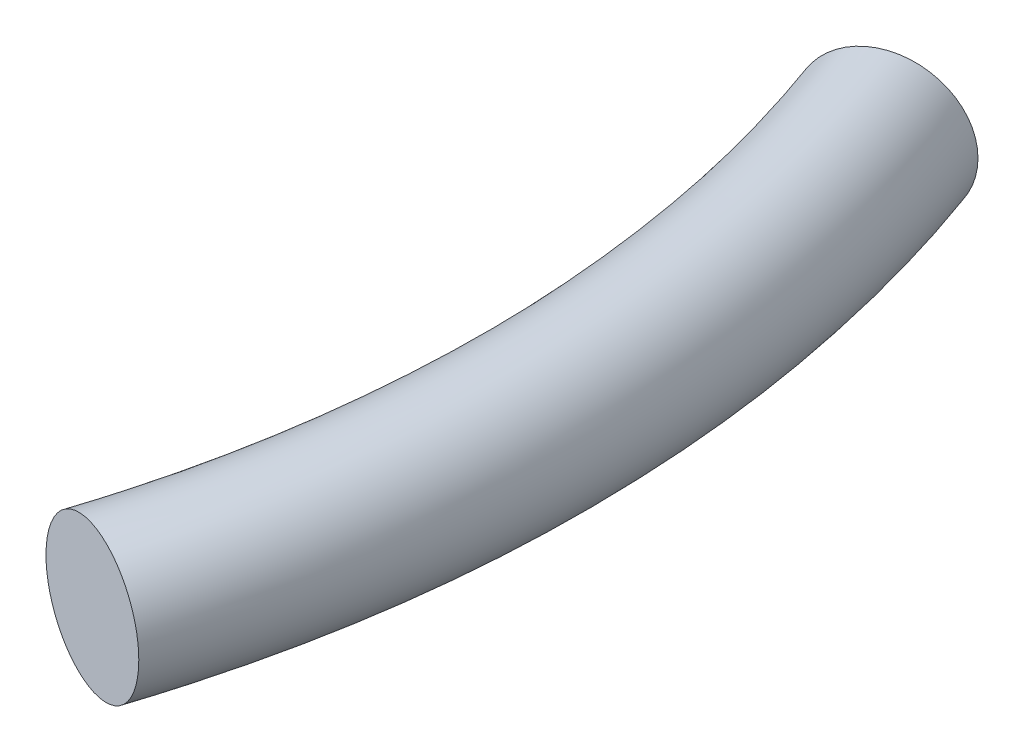
ISO-10303-21;
HEADER;
FILE_DESCRIPTION(('STEP AP214'),'2;1');
FILE_NAME('part.step','',(''),(''),'','','');
FILE_SCHEMA(('AUTOMOTIVE_DESIGN { 1 0 10303 214 1 1 1 1 }'));
ENDSEC;
DATA;
#1=APPLICATION_CONTEXT('core data for automotive mechanical design processes');
#2=APPLICATION_PROTOCOL_DEFINITION('international standard','automotive_design',2000,#1);
#3=PRODUCT_CONTEXT('',#1,'mechanical');
#4=PRODUCT('Part','Part','',(#3));
#5=PRODUCT_RELATED_PRODUCT_CATEGORY('part','',(#4));
#6=PRODUCT_DEFINITION_FORMATION('','',#4);
#7=PRODUCT_DEFINITION_CONTEXT('part definition',#1,'design');
#8=PRODUCT_DEFINITION('design','',#6,#7);
#9=PRODUCT_DEFINITION_SHAPE('','',#8);
#10=(LENGTH_UNIT() NAMED_UNIT(*) SI_UNIT(.MILLI.,.METRE.));
#11=(NAMED_UNIT(*) PLANE_ANGLE_UNIT() SI_UNIT($,.RADIAN.));
#12=(NAMED_UNIT(*) SI_UNIT($,.STERADIAN.) SOLID_ANGLE_UNIT());
#13=UNCERTAINTY_MEASURE_WITH_UNIT(LENGTH_MEASURE(1.E-05),#10,'distance_accuracy_value','');
#14=(GEOMETRIC_REPRESENTATION_CONTEXT(3) GLOBAL_UNCERTAINTY_ASSIGNED_CONTEXT((#13)) GLOBAL_UNIT_ASSIGNED_CONTEXT((#10,
#11,#12)) REPRESENTATION_CONTEXT('',''));
#15=CARTESIAN_POINT('',(0.,0.,0.));
#16=DIRECTION('',(0.,0.,1.));
#17=DIRECTION('',(1.,0.,0.));
#18=AXIS2_PLACEMENT_3D('',#15,#16,#17);
#19=CARTESIAN_POINT('',(0.,6.,0.));
#20=DIRECTION('',(-0.342020143325699,0.,-0.939692620785897));
#21=DIRECTION('',(-0.939692620785897,0.,0.342020143325699));
#22=AXIS2_PLACEMENT_3D('',#19,#20,#21);
#23=PLANE('',#22);
#24=CARTESIAN_POINT('',(6.82421302934355,0.730199999999999,-2.48381041497289));
#25=CARTESIAN_POINT('',(6.82421129497327,0.752655241559639,-2.48380978371374));
#26=CARTESIAN_POINT('',(6.82242963591551,0.775130857259378,-2.4831613128491));
#27=CARTESIAN_POINT('',(6.81534161789126,0.819482451297504,-2.48058148526833));
#28=CARTESIAN_POINT('',(6.81002771527244,0.841357041711002,-2.47864738288729));
#29=CARTESIAN_POINT('',(6.79603352222431,0.883809618347232,-2.4735539131652));
#30=CARTESIAN_POINT('',(6.78735924020571,0.904389843003348,-2.47039673270679));
#31=CARTESIAN_POINT('',(6.76687443218714,0.943737337222424,-2.46294087233338));
#32=CARTESIAN_POINT('',(6.75505945707419,0.962501982989582,-2.45864057307367));
#33=CARTESIAN_POINT('',(6.72865380553962,0.99762748493817,-2.44902970189868));
#34=CARTESIAN_POINT('',(6.71406706652031,1.01399169330263,-2.44372056308064));
#35=CARTESIAN_POINT('',(6.68249826555502,1.0439048849067,-2.4322304591978));
#36=CARTESIAN_POINT('',(6.66551287897885,1.05744989503907,-2.42604828406657));
#37=CARTESIAN_POINT('',(6.62965832272644,1.08130194187445,-2.41299829282786));
#38=CARTESIAN_POINT('',(6.6107905341322,1.0916113298001,-2.40613097939313));
#39=CARTESIAN_POINT('',(6.57169519309986,1.10871348302438,-2.39190143895887));
#40=CARTESIAN_POINT('',(6.55146756074491,1.11550604143746,-2.38453918287199));
#41=CARTESIAN_POINT('',(6.51022839819317,1.12538061292917,-2.36952935521709));
#42=CARTESIAN_POINT('',(6.48921689106719,1.12846273512374,-2.36188179204616));
#43=CARTESIAN_POINT('',(6.44700586567826,1.1308293161772,-2.34651823524673));
#44=CARTESIAN_POINT('',(6.4258063474153,1.13011377503608,-2.33880224161823));
#45=CARTESIAN_POINT('',(6.38382046538139,1.12490525493437,-2.32352063029848));
#46=CARTESIAN_POINT('',(6.36303411377941,1.12041216488209,-2.31595501703636));
#47=CARTESIAN_POINT('',(6.32246653349717,1.10777635092602,-2.30118962533742));
#48=CARTESIAN_POINT('',(6.30268524577036,1.09963384169881,-2.29398982540941));
#49=CARTESIAN_POINT('',(6.26467402476153,1.07992311451522,-2.28015487239408));
#50=CARTESIAN_POINT('',(6.24644523275613,1.06835240391896,-2.27352013469748));
#51=CARTESIAN_POINT('',(6.212097563762,1.04213485030234,-2.26101860556719));
#52=CARTESIAN_POINT('',(6.19597577285272,1.02749233015651,-2.25515075355315));
#53=CARTESIAN_POINT('',(6.16624800679594,0.995513974748311,-2.24433073157725));
#54=CARTESIAN_POINT('',(6.15264561625898,0.978174365577651,-2.23937986630693));
#55=CARTESIAN_POINT('',(6.12838903675539,0.941335318357768,-2.23055119338251));
#56=CARTESIAN_POINT('',(6.11773068237938,0.921838987081609,-2.22667186964338));
#57=CARTESIAN_POINT('',(6.09962219041487,0.881186262625344,-2.22008091758085));
#58=CARTESIAN_POINT('',(6.09217780695206,0.860026971539702,-2.21737138358792));
#59=CARTESIAN_POINT('',(6.08074974899613,0.816713490035981,-2.21321191065649));
#60=CARTESIAN_POINT('',(6.07675870965542,0.794561523394872,-2.21175929113269));
#61=CARTESIAN_POINT('',(6.07315247693565,0.758269762147005,-2.21044672976486));
#62=CARTESIAN_POINT('',(6.07245784839844,0.744238862857464,-2.21019390565344));
#63=CARTESIAN_POINT('',(6.07246066708511,0.70774475844036,-2.21019493157149));
#64=CARTESIAN_POINT('',(6.07424232614287,0.685269142740621,-2.21084340243612));
#65=CARTESIAN_POINT('',(6.08133034416712,0.640917548702495,-2.2134232300169));
#66=CARTESIAN_POINT('',(6.08664424678594,0.619042958288996,-2.21535733239794));
#67=CARTESIAN_POINT('',(6.10063843983407,0.576590381652766,-2.22045080212003));
#68=CARTESIAN_POINT('',(6.10931272185267,0.556010156996651,-2.22360798257843));
#69=CARTESIAN_POINT('',(6.12979752987124,0.516662662777575,-2.23106384295185));
#70=CARTESIAN_POINT('',(6.14161250498419,0.497898017010418,-2.23536414221156));
#71=CARTESIAN_POINT('',(6.16801815651876,0.462772515061829,-2.24497501338655));
#72=CARTESIAN_POINT('',(6.18260489553807,0.446408306697369,-2.25028415220459));
#73=CARTESIAN_POINT('',(6.21417369650336,0.416495115093301,-2.26177425608743));
#74=CARTESIAN_POINT('',(6.23115908307953,0.402950104960929,-2.26795643121866));
#75=CARTESIAN_POINT('',(6.26701363933194,0.379098058125552,-2.28100642245736));
#76=CARTESIAN_POINT('',(6.28588142792618,0.368788670199895,-2.28787373589209));
#77=CARTESIAN_POINT('',(6.32497676895852,0.351686516975621,-2.30210327632635));
#78=CARTESIAN_POINT('',(6.34520440131347,0.344893958562538,-2.30946553241323));
#79=CARTESIAN_POINT('',(6.38644356386521,0.335019387070832,-2.32447536006814));
#80=CARTESIAN_POINT('',(6.40745507099119,0.331937264876257,-2.33212292323906));
#81=CARTESIAN_POINT('',(6.44966609638012,0.329570683822803,-2.34748648003849));
#82=CARTESIAN_POINT('',(6.47086561464307,0.330286224963925,-2.35520247366699));
#83=CARTESIAN_POINT('',(6.51285149667699,0.335494745065634,-2.37048408498675));
#84=CARTESIAN_POINT('',(6.53363784827897,0.339987835117909,-2.37804969824886));
#85=CARTESIAN_POINT('',(6.57420542856121,0.352623649073976,-2.3928150899478));
#86=CARTESIAN_POINT('',(6.59398671628802,0.360766158301187,-2.40001488987582));
#87=CARTESIAN_POINT('',(6.63199793729685,0.380476885484782,-2.41384984289115));
#88=CARTESIAN_POINT('',(6.65022672930225,0.392047596081044,-2.42048458058774));
#89=CARTESIAN_POINT('',(6.68457439829638,0.418265149697662,-2.43298610971804));
#90=CARTESIAN_POINT('',(6.70069618920566,0.432907669843492,-2.43885396173208));
#91=CARTESIAN_POINT('',(6.73042395526244,0.46488602525169,-2.44967398370798));
#92=CARTESIAN_POINT('',(6.7440263457994,0.482225634422349,-2.45462484897829));
#93=CARTESIAN_POINT('',(6.76828292530299,0.519064681642232,-2.46345352190271));
#94=CARTESIAN_POINT('',(6.778941279679,0.538561012918392,-2.46733284564184));
#95=CARTESIAN_POINT('',(6.79704977164351,0.579213737374657,-2.47392379770437));
#96=CARTESIAN_POINT('',(6.80449415510632,0.600373028460299,-2.4766333316973));
#97=CARTESIAN_POINT('',(6.81592221306226,0.64368650996402,-2.48079280462873));
#98=CARTESIAN_POINT('',(6.81991325240296,0.665838476605128,-2.48224542415253));
#99=CARTESIAN_POINT('',(6.82351948512273,0.702130237852995,-2.48355798552037));
#100=CARTESIAN_POINT('',(6.82421411365994,0.716161137142535,-2.48381080963178));
#101=CARTESIAN_POINT('',(6.82421302934355,0.730199999999999,-2.48381041497289));
#102=B_SPLINE_CURVE_WITH_KNOTS('',3,(#24,#25,#26,#27,#28,#29,#30,#31,#32,#33,#34,#35,#36,#37,
#38,#39,#40,#41,#42,#43,#44,#45,#46,#47,#48,#49,#50,#51,#52,#53,#54,#55,#56,#57,#58,#59,#60,#61,
#62,#63,#64,#65,#66,#67,#68,#69,#70,#71,#72,#73,#74,#75,#76,#77,#78,#79,#80,#81,#82,#83,#84,#85,
#86,#87,#88,#89,#90,#91,#92,#93,#94,#95,#96,#97,#98,#99,#100,#101),.UNSPECIFIED.,.T.,.F.,(4,2,2,
2,2,2,2,2,2,2,2,2,2,2,2,2,2,2,2,2,2,2,2,2,2,2,2,2,2,2,2,2,2,2,2,2,2,2,4),(0.,0.0673217190940751,
0.134787678055462,0.2021335594909,0.269575356418626,0.336922056232694,0.40436303479347,
0.471754892083668,0.539150713403567,0.606544552708823,0.67393839201408,0.741334213333977,
0.808726070624173,0.876167049184948,0.943513748999017,1.01095554592846,1.07830142736561,
1.14576738632871,1.2130891054245,1.25517818200736,1.32249990110144,1.38996586006282,
1.45731174149826,1.52475353842599,1.59210023824006,1.65954121680083,1.72693307409103,
1.79432889541093,1.86172273471618,1.92911657402144,1.99651239534134,2.06390425263154,
2.13134523119231,2.19869193100638,2.26613372793582,2.33347960937297,2.40094556833608,
2.46826728743186,2.51035636401472),.UNSPECIFIED.);
#103=CARTESIAN_POINT('',(6.82421302934355,0.730199999999999,-2.48381041497289));
#104=VERTEX_POINT('',#103);
#105=EDGE_CURVE('E18',#104,#104,#102,.T.);
#106=ORIENTED_EDGE('',*,*,#105,.F.);
#107=EDGE_LOOP('',(#106));
#108=FACE_BOUND('',#107,.T.);
#109=ADVANCED_FACE('F14',(#108),#23,.T.);
#110=CARTESIAN_POINT('',(0.,6.,0.));
#111=DIRECTION('',(0.309016994374891,0.,-0.951056516295172));
#112=DIRECTION('',(-0.951056516295172,0.,-0.309016994374891));
#113=AXIS2_PLACEMENT_3D('',#110,#111,#112);
#114=PLANE('',#113);
#115=CARTESIAN_POINT('',(6.14589442350119,0.7302,1.99692214916312));
#116=CARTESIAN_POINT('',(6.14589617884557,0.75265524155964,1.99692271950908));
#117=CARTESIAN_POINT('',(6.14769938387157,0.775130857259379,1.99750861633837));
#118=CARTESIAN_POINT('',(6.1548731187509,0.819482451297505,1.99983950409622));
#119=CARTESIAN_POINT('',(6.16025128348349,0.841357041711003,2.00158697574742));
#120=CARTESIAN_POINT('',(6.17441471117709,0.883809618347234,2.00618895237124));
#121=CARTESIAN_POINT('',(6.18319389306645,0.904389843003349,2.00904148148391));
#122=CARTESIAN_POINT('',(6.20392642806798,0.943737337222425,2.01577789045874));
#123=CARTESIAN_POINT('',(6.21588428409716,0.962501982989582,2.01966323340734));
#124=CARTESIAN_POINT('',(6.24260926458915,0.997627484938171,2.02834670595062));
#125=CARTESIAN_POINT('',(6.25737240403384,1.01399169330263,2.03314354073444));
#126=CARTESIAN_POINT('',(6.28932297298112,1.0439048849067,2.04352490989125));
#127=CARTESIAN_POINT('',(6.30651376731932,1.05744989503907,2.04911053756562));
#128=CARTESIAN_POINT('',(6.34280192007102,1.08130194187445,2.06090127313455));
#129=CARTESIAN_POINT('',(6.36189788070081,1.0916113298001,2.06710592686166));
#130=CARTESIAN_POINT('',(6.40146600970718,1.10871348302438,2.07996239131891));
#131=CARTESIAN_POINT('',(6.42193825896706,1.11550604143746,2.08661422832963));
#132=CARTESIAN_POINT('',(6.46367613516597,1.12538061292917,2.10017568638559));
#133=CARTESIAN_POINT('',(6.48494173875519,1.12846273512374,2.107085299844));
#134=CARTESIAN_POINT('',(6.52766323072782,1.1308293161772,2.12096635403837));
#135=CARTESIAN_POINT('',(6.54911911911123,1.13011377503608,2.12793779477431));
#136=CARTESIAN_POINT('',(6.59161274502409,1.12490525493437,2.14174481079775));
#137=CARTESIAN_POINT('',(6.6126504702374,1.12041216488209,2.14858038208349));
#138=CARTESIAN_POINT('',(6.65370864258475,1.10777635092602,2.16192099097046));
#139=CARTESIAN_POINT('',(6.67372914947939,1.09963384169881,2.1684260479891));
#140=CARTESIAN_POINT('',(6.71220004797655,1.07992311451522,2.1809260006426));
#141=CARTESIAN_POINT('',(6.73064928450075,1.06835240391896,2.18692052096977));
#142=CARTESIAN_POINT('',(6.76541232689763,1.04213485030234,2.19821571814549));
#143=CARTESIAN_POINT('',(6.7817290819295,1.02749233015651,2.20351735323395));
#144=CARTESIAN_POINT('',(6.81181635195569,0.995513974748309,2.21329329987134));
#145=CARTESIAN_POINT('',(6.82558323899003,0.978174365577649,2.21776643262461));
#146=CARTESIAN_POINT('',(6.85013315828239,0.941335318357767,2.22574318494362));
#147=CARTESIAN_POINT('',(6.86092040632294,0.921838987081607,2.22924817430015));
#148=CARTESIAN_POINT('',(6.87924788799319,0.881186262625342,2.23520313407716));
#149=CARTESIAN_POINT('',(6.88678229791139,0.8600269715397,2.23765121225907));
#150=CARTESIAN_POINT('',(6.89834855771505,0.81671349003598,2.24140931788103));
#151=CARTESIAN_POINT('',(6.9023878615127,0.794561523394871,2.24272176724395));
#152=CARTESIAN_POINT('',(6.90603770514406,0.758269762147004,2.24390767332795));
#153=CARTESIAN_POINT('',(6.90674073396658,0.744238862857464,2.24413610123941));
#154=CARTESIAN_POINT('',(6.90673788119295,0.70774475844036,2.24413517431707));
#155=CARTESIAN_POINT('',(6.90493467616695,0.685269142740621,2.24354927748777));
#156=CARTESIAN_POINT('',(6.89776094128762,0.640917548702495,2.24121838972993));
#157=CARTESIAN_POINT('',(6.89238277655503,0.619042958288997,2.23947091807872));
#158=CARTESIAN_POINT('',(6.87821934886143,0.576590381652767,2.2348689414549));
#159=CARTESIAN_POINT('',(6.86944016697206,0.556010156996652,2.23201641234224));
#160=CARTESIAN_POINT('',(6.84870763197054,0.516662662777576,2.2252800033674));
#161=CARTESIAN_POINT('',(6.83674977594136,0.497898017010418,2.22139466041881));
#162=CARTESIAN_POINT('',(6.81002479544937,0.46277251506183,2.21271118787552));
#163=CARTESIAN_POINT('',(6.79526165600468,0.446408306697369,2.20791435309171));
#164=CARTESIAN_POINT('',(6.7633110870574,0.416495115093301,2.19753298393489));
#165=CARTESIAN_POINT('',(6.7461202927192,0.40295010496093,2.19194735626052));
#166=CARTESIAN_POINT('',(6.70983213996749,0.379098058125552,2.18015662069159));
#167=CARTESIAN_POINT('',(6.69073617933771,0.368788670199895,2.17395196696448));
#168=CARTESIAN_POINT('',(6.65116805033134,0.351686516975622,2.16109550250723));
#169=CARTESIAN_POINT('',(6.63069580107146,0.344893958562538,2.15444366549651));
#170=CARTESIAN_POINT('',(6.58895792487255,0.335019387070832,2.14088220744056));
#171=CARTESIAN_POINT('',(6.56769232128333,0.331937264876257,2.13397259398214));
#172=CARTESIAN_POINT('',(6.5249708293107,0.329570683822803,2.12009153978778));
#173=CARTESIAN_POINT('',(6.50351494092729,0.330286224963925,2.11312009905184));
#174=CARTESIAN_POINT('',(6.46102131501443,0.335494745065634,2.0993130830284));
#175=CARTESIAN_POINT('',(6.43998358980112,0.339987835117909,2.09247751174266));
#176=CARTESIAN_POINT('',(6.39892541745377,0.352623649073976,2.07913690285568));
#177=CARTESIAN_POINT('',(6.37890491055913,0.360766158301186,2.07263184583705));
#178=CARTESIAN_POINT('',(6.34043401206197,0.380476885484781,2.06013189318355));
#179=CARTESIAN_POINT('',(6.32198477553777,0.392047596081043,2.05413737285638));
#180=CARTESIAN_POINT('',(6.28722173314089,0.418265149697662,2.04284217568065));
#181=CARTESIAN_POINT('',(6.27090497810902,0.432907669843492,2.03754054059219));
#182=CARTESIAN_POINT('',(6.24081770808283,0.46488602525169,2.02776459395481));
#183=CARTESIAN_POINT('',(6.22705082104849,0.482225634422349,2.02329146120154));
#184=CARTESIAN_POINT('',(6.20250090175613,0.519064681642232,2.01531470888252));
#185=CARTESIAN_POINT('',(6.19171365371558,0.538561012918391,2.011809719526));
#186=CARTESIAN_POINT('',(6.17338617204533,0.579213737374657,2.00585475974899));
#187=CARTESIAN_POINT('',(6.16585176212713,0.600373028460299,2.00340668156707));
#188=CARTESIAN_POINT('',(6.15428550232347,0.64368650996402,1.99964857594512));
#189=CARTESIAN_POINT('',(6.15024619852582,0.665838476605129,1.99833612658219));
#190=CARTESIAN_POINT('',(6.14659635489446,0.702130237852996,1.99715022049819));
#191=CARTESIAN_POINT('',(6.14589332607194,0.716161137142536,1.99692179258674));
#192=CARTESIAN_POINT('',(6.14589442350119,0.7302,1.99692214916312));
#193=B_SPLINE_CURVE_WITH_KNOTS('',3,(#115,#116,#117,#118,#119,#120,#121,#122,#123,#124,#125,
#126,#127,#128,#129,#130,#131,#132,#133,#134,#135,#136,#137,#138,#139,#140,#141,#142,#143,#144,
#145,#146,#147,#148,#149,#150,#151,#152,#153,#154,#155,#156,#157,#158,#159,#160,#161,#162,#163,
#164,#165,#166,#167,#168,#169,#170,#171,#172,#173,#174,#175,#176,#177,#178,#179,#180,#181,#182,
#183,#184,#185,#186,#187,#188,#189,#190,#191,#192),.UNSPECIFIED.,.T.,.F.,(4,2,2,2,2,2,2,2,2,2,2,
2,2,2,2,2,2,2,2,2,2,2,2,2,2,2,2,2,2,2,2,2,2,2,2,2,2,2,4),(0.,0.0673217190940752,
0.134787678055461,0.2021335594909,0.269575356418626,0.336922056232695,0.40436303479347,
0.471754892083666,0.539150713403564,0.606544552708821,0.673938392014078,0.741334213333977,
0.808726070624175,0.87616704918495,0.94351374899902,1.01095554592846,1.07830142736561,
1.14576738632871,1.2130891054245,1.25517818200736,1.32249990110144,1.38996586006282,
1.45731174149826,1.52475353842599,1.59210023824006,1.65954121680083,1.72693307409103,
1.79432889541093,1.86172273471618,1.92911657402144,1.99651239534134,2.06390425263153,
2.13134523119231,2.19869193100638,2.26613372793582,2.33347960937297,2.40094556833608,
2.46826728743186,2.51035636401472),.UNSPECIFIED.);
#194=CARTESIAN_POINT('',(6.14589442350119,0.7302,1.99692214916312));
#195=VERTEX_POINT('',#194);
#196=EDGE_CURVE('E10',#195,#195,#193,.T.);
#197=ORIENTED_EDGE('',*,*,#196,.F.);
#198=EDGE_LOOP('',(#197));
#199=FACE_BOUND('',#198,.T.);
#200=ADVANCED_FACE('F34',(#199),#114,.F.);
#201=CARTESIAN_POINT('',(0.,0.7302,0.));
#202=DIRECTION('',(0.,-1.,0.));
#203=DIRECTION('',(-0.342020143325699,0.,-0.939692620785897));
#204=AXIS2_PLACEMENT_3D('',#201,#202,#203);
#205=TOROIDAL_SURFACE('',#204,6.862175820468,0.4);
#206=ORIENTED_EDGE('',*,*,#196,.T.);
#207=EDGE_LOOP('',(#206));
#208=FACE_BOUND('',#207,.T.);
#209=ORIENTED_EDGE('',*,*,#105,.T.);
#210=EDGE_LOOP('',(#209));
#211=FACE_BOUND('',#210,.T.);
#212=ADVANCED_FACE('F36',(#208,#211),#205,.T.);
#213=CLOSED_SHELL('',(#109,#200,#212));
#214=MANIFOLD_SOLID_BREP('B1',#213);
#215=ADVANCED_BREP_SHAPE_REPRESENTATION('',(#18,#214),#14);
#216=SHAPE_DEFINITION_REPRESENTATION(#9,#215);
ENDSEC;
END-ISO-10303-21;
